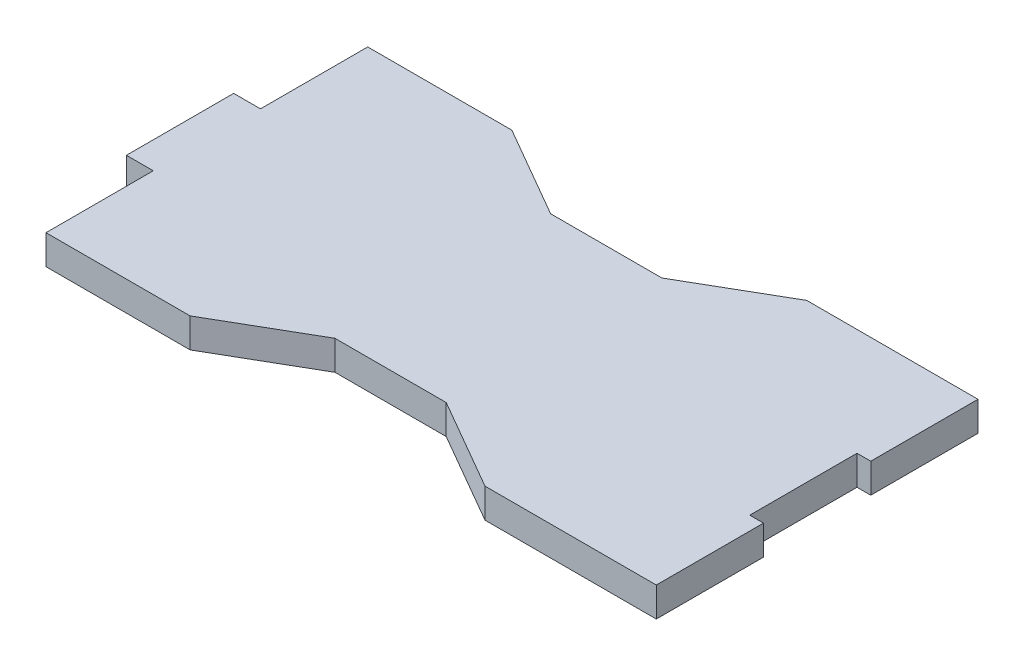
ISO-10303-21;
HEADER;
FILE_DESCRIPTION(('STEP AP214'),'2;1');
FILE_NAME('part.step','',(''),(''),'','','');
FILE_SCHEMA(('AUTOMOTIVE_DESIGN { 1 0 10303 214 1 1 1 1 }'));
ENDSEC;
DATA;
#1=APPLICATION_CONTEXT('core data for automotive mechanical design processes');
#2=APPLICATION_PROTOCOL_DEFINITION('international standard','automotive_design',2000,#1);
#3=PRODUCT_CONTEXT('',#1,'mechanical');
#4=PRODUCT('Part','Part','',(#3));
#5=PRODUCT_RELATED_PRODUCT_CATEGORY('part','',(#4));
#6=PRODUCT_DEFINITION_FORMATION('','',#4);
#7=PRODUCT_DEFINITION_CONTEXT('part definition',#1,'design');
#8=PRODUCT_DEFINITION('design','',#6,#7);
#9=PRODUCT_DEFINITION_SHAPE('','',#8);
#10=(LENGTH_UNIT() NAMED_UNIT(*) SI_UNIT(.MILLI.,.METRE.));
#11=(NAMED_UNIT(*) PLANE_ANGLE_UNIT() SI_UNIT($,.RADIAN.));
#12=(NAMED_UNIT(*) SI_UNIT($,.STERADIAN.) SOLID_ANGLE_UNIT());
#13=UNCERTAINTY_MEASURE_WITH_UNIT(LENGTH_MEASURE(1.E-05),#10,'distance_accuracy_value','');
#14=(GEOMETRIC_REPRESENTATION_CONTEXT(3) GLOBAL_UNCERTAINTY_ASSIGNED_CONTEXT((#13)) GLOBAL_UNIT_ASSIGNED_CONTEXT((#10,
#11,#12)) REPRESENTATION_CONTEXT('',''));
#15=CARTESIAN_POINT('',(0.,0.,0.));
#16=DIRECTION('',(0.,0.,1.));
#17=DIRECTION('',(1.,0.,0.));
#18=AXIS2_PLACEMENT_3D('',#15,#16,#17);
#19=CARTESIAN_POINT('',(-136.268191522893,2.2,-1.89110104690935E-12));
#20=DIRECTION('',(-1.,0.,0.));
#21=DIRECTION('',(0.,0.,1.));
#22=AXIS2_PLACEMENT_3D('',#19,#20,#21);
#23=PLANE('',#22);
#24=DIRECTION('',(0.,0.,-1.));
#25=VECTOR('',#24,1.);
#26=CARTESIAN_POINT('',(-136.268191522893,0.,-1.89110104690935E-12));
#27=LINE('',#26,#25);
#28=CARTESIAN_POINT('',(-136.268191522893,0.,-3.8659042385574));
#29=VERTEX_POINT('',#28);
#30=CARTESIAN_POINT('',(-136.268191522893,0.,-11.8659042385511));
#31=VERTEX_POINT('',#30);
#32=EDGE_CURVE('E201',#29,#31,#27,.T.);
#33=ORIENTED_EDGE('',*,*,#32,.F.);
#34=DIRECTION('',(0.,-1.,0.));
#35=VECTOR('',#34,1.);
#36=CARTESIAN_POINT('',(-136.268191522893,2.2,-3.8659042385574));
#37=LINE('',#36,#35);
#38=CARTESIAN_POINT('',(-136.268191522893,2.2,-3.8659042385574));
#39=VERTEX_POINT('',#38);
#40=EDGE_CURVE('E11',#39,#29,#37,.T.);
#41=ORIENTED_EDGE('',*,*,#40,.F.);
#42=DIRECTION('',(0.,0.,-1.));
#43=VECTOR('',#42,1.);
#44=CARTESIAN_POINT('',(-136.268191522893,2.2,-1.89110104690935E-12));
#45=LINE('',#44,#43);
#46=CARTESIAN_POINT('',(-136.268191522893,2.2,-11.8659042385511));
#47=VERTEX_POINT('',#46);
#48=EDGE_CURVE('E249',#39,#47,#45,.T.);
#49=ORIENTED_EDGE('',*,*,#48,.T.);
#50=DIRECTION('',(0.,-1.,0.));
#51=VECTOR('',#50,1.);
#52=CARTESIAN_POINT('',(-136.268191522893,2.2,-11.8659042385511));
#53=LINE('',#52,#51);
#54=EDGE_CURVE('E123',#47,#31,#53,.T.);
#55=ORIENTED_EDGE('',*,*,#54,.T.);
#56=EDGE_LOOP('',(#33,#41,#49,#55));
#57=FACE_BOUND('',#56,.T.);
#58=ADVANCED_FACE('F37',(#57),#23,.T.);
#59=CARTESIAN_POINT('',(0.,2.2,-3.8659042385574));
#60=DIRECTION('',(0.,0.,-1.));
#61=DIRECTION('',(-1.,0.,0.));
#62=AXIS2_PLACEMENT_3D('',#59,#60,#61);
#63=PLANE('',#62);
#64=DIRECTION('',(1.,0.,0.));
#65=VECTOR('',#64,1.);
#66=CARTESIAN_POINT('',(0.,0.,-3.8659042385574));
#67=LINE('',#66,#65);
#68=CARTESIAN_POINT('',(-138.268191522885,0.,-3.8659042385574));
#69=VERTEX_POINT('',#68);
#70=EDGE_CURVE('E204',#69,#29,#67,.T.);
#71=ORIENTED_EDGE('',*,*,#70,.F.);
#72=DIRECTION('',(0.,-1.,0.));
#73=VECTOR('',#72,1.);
#74=CARTESIAN_POINT('',(-138.268191522885,2.2,-3.8659042385574));
#75=LINE('',#74,#73);
#76=CARTESIAN_POINT('',(-138.268191522885,2.2,-3.8659042385574));
#77=VERTEX_POINT('',#76);
#78=EDGE_CURVE('E45',#77,#69,#75,.T.);
#79=ORIENTED_EDGE('',*,*,#78,.F.);
#80=DIRECTION('',(1.,0.,0.));
#81=VECTOR('',#80,1.);
#82=CARTESIAN_POINT('',(0.,2.2,-3.8659042385574));
#83=LINE('',#82,#81);
#84=EDGE_CURVE('E309',#77,#39,#83,.T.);
#85=ORIENTED_EDGE('',*,*,#84,.T.);
#86=ORIENTED_EDGE('',*,*,#40,.T.);
#87=EDGE_LOOP('',(#71,#79,#85,#86));
#88=FACE_BOUND('',#87,.T.);
#89=ADVANCED_FACE('F297',(#88),#63,.T.);
#90=CARTESIAN_POINT('',(-138.268191522885,2.2,0.));
#91=DIRECTION('',(-1.,0.,0.));
#92=DIRECTION('',(0.,0.,1.));
#93=AXIS2_PLACEMENT_3D('',#90,#91,#92);
#94=PLANE('',#93);
#95=DIRECTION('',(0.,0.,-1.));
#96=VECTOR('',#95,1.);
#97=CARTESIAN_POINT('',(-138.268191522885,0.,0.));
#98=LINE('',#97,#96);
#99=CARTESIAN_POINT('',(-138.268191522885,0.,4.13409576144266));
#100=VERTEX_POINT('',#99);
#101=EDGE_CURVE('E207',#100,#69,#98,.T.);
#102=ORIENTED_EDGE('',*,*,#101,.F.);
#103=DIRECTION('',(0.,-1.,0.));
#104=VECTOR('',#103,1.);
#105=CARTESIAN_POINT('',(-138.268191522885,2.2,4.13409576144266));
#106=LINE('',#105,#104);
#107=CARTESIAN_POINT('',(-138.268191522885,2.2,4.13409576144266));
#108=VERTEX_POINT('',#107);
#109=EDGE_CURVE('E286',#108,#100,#106,.T.);
#110=ORIENTED_EDGE('',*,*,#109,.F.);
#111=DIRECTION('',(0.,0.,-1.));
#112=VECTOR('',#111,1.);
#113=CARTESIAN_POINT('',(-138.268191522885,2.2,0.));
#114=LINE('',#113,#112);
#115=EDGE_CURVE('E293',#108,#77,#114,.T.);
#116=ORIENTED_EDGE('',*,*,#115,.T.);
#117=ORIENTED_EDGE('',*,*,#78,.T.);
#118=EDGE_LOOP('',(#102,#110,#116,#117));
#119=FACE_BOUND('',#118,.T.);
#120=ADVANCED_FACE('F291',(#119),#94,.T.);
#121=CARTESIAN_POINT('',(-1.14744207509082E-13,2.2,4.1340957614465));
#122=DIRECTION('',(0.,0.,1.));
#123=DIRECTION('',(1.,0.,0.));
#124=AXIS2_PLACEMENT_3D('',#121,#122,#123);
#125=PLANE('',#124);
#126=DIRECTION('',(-1.,0.,0.));
#127=VECTOR('',#126,1.);
#128=CARTESIAN_POINT('',(-1.14744207509082E-13,0.,4.1340957614465));
#129=LINE('',#128,#127);
#130=CARTESIAN_POINT('',(-136.268191522893,0.,4.13409576144272));
#131=VERTEX_POINT('',#130);
#132=EDGE_CURVE('E210',#131,#100,#129,.T.);
#133=ORIENTED_EDGE('',*,*,#132,.F.);
#134=DIRECTION('',(0.,-1.,0.));
#135=VECTOR('',#134,1.);
#136=CARTESIAN_POINT('',(-136.268191522893,2.2,4.13409576144272));
#137=LINE('',#136,#135);
#138=CARTESIAN_POINT('',(-136.268191522893,2.2,4.13409576144272));
#139=VERTEX_POINT('',#138);
#140=EDGE_CURVE('E284',#139,#131,#137,.T.);
#141=ORIENTED_EDGE('',*,*,#140,.F.);
#142=DIRECTION('',(-1.,0.,0.));
#143=VECTOR('',#142,1.);
#144=CARTESIAN_POINT('',(-1.14744207509082E-13,2.2,4.1340957614465));
#145=LINE('',#144,#143);
#146=EDGE_CURVE('E306',#139,#108,#145,.T.);
#147=ORIENTED_EDGE('',*,*,#146,.T.);
#148=ORIENTED_EDGE('',*,*,#109,.T.);
#149=EDGE_LOOP('',(#133,#141,#147,#148));
#150=FACE_BOUND('',#149,.T.);
#151=ADVANCED_FACE('F303',(#150),#125,.T.);
#152=CARTESIAN_POINT('',(-136.268191522893,2.2,-1.89110104690933E-12));
#153=DIRECTION('',(-1.,0.,0.));
#154=DIRECTION('',(0.,0.,1.));
#155=AXIS2_PLACEMENT_3D('',#152,#153,#154);
#156=PLANE('',#155);
#157=DIRECTION('',(0.,0.,-1.));
#158=VECTOR('',#157,1.);
#159=CARTESIAN_POINT('',(-136.268191522893,0.,-1.89110104690933E-12));
#160=LINE('',#159,#158);
#161=CARTESIAN_POINT('',(-136.268191522893,0.,12.1340957614512));
#162=VERTEX_POINT('',#161);
#163=EDGE_CURVE('E213',#162,#131,#160,.T.);
#164=ORIENTED_EDGE('',*,*,#163,.F.);
#165=DIRECTION('',(0.,-1.,0.));
#166=VECTOR('',#165,1.);
#167=CARTESIAN_POINT('',(-136.268191522893,2.2,12.1340957614512));
#168=LINE('',#167,#166);
#169=CARTESIAN_POINT('',(-136.268191522893,2.2,12.1340957614512));
#170=VERTEX_POINT('',#169);
#171=EDGE_CURVE('E282',#170,#162,#168,.T.);
#172=ORIENTED_EDGE('',*,*,#171,.F.);
#173=DIRECTION('',(0.,0.,-1.));
#174=VECTOR('',#173,1.);
#175=CARTESIAN_POINT('',(-136.268191522893,2.2,-1.89110104690933E-12));
#176=LINE('',#175,#174);
#177=EDGE_CURVE('E311',#170,#139,#176,.T.);
#178=ORIENTED_EDGE('',*,*,#177,.T.);
#179=ORIENTED_EDGE('',*,*,#140,.T.);
#180=EDGE_LOOP('',(#164,#172,#178,#179));
#181=FACE_BOUND('',#180,.T.);
#182=ADVANCED_FACE('F367',(#181),#156,.T.);
#183=CARTESIAN_POINT('',(0.,2.2,12.1340957614512));
#184=DIRECTION('',(0.,0.,1.));
#185=DIRECTION('',(1.,0.,0.));
#186=AXIS2_PLACEMENT_3D('',#183,#184,#185);
#187=PLANE('',#186);
#188=DIRECTION('',(-1.,0.,0.));
#189=VECTOR('',#188,1.);
#190=CARTESIAN_POINT('',(0.,0.,12.1340957614512));
#191=LINE('',#190,#189);
#192=CARTESIAN_POINT('',(-125.518191522863,0.,12.1340957614512));
#193=VERTEX_POINT('',#192);
#194=EDGE_CURVE('E216',#193,#162,#191,.T.);
#195=ORIENTED_EDGE('',*,*,#194,.F.);
#196=DIRECTION('',(0.,-1.,0.));
#197=VECTOR('',#196,1.);
#198=CARTESIAN_POINT('',(-125.518191522863,2.2,12.1340957614512));
#199=LINE('',#198,#197);
#200=CARTESIAN_POINT('',(-125.518191522863,2.2,12.1340957614512));
#201=VERTEX_POINT('',#200);
#202=EDGE_CURVE('E280',#201,#193,#199,.T.);
#203=ORIENTED_EDGE('',*,*,#202,.F.);
#204=DIRECTION('',(-1.,0.,0.));
#205=VECTOR('',#204,1.);
#206=CARTESIAN_POINT('',(0.,2.2,12.1340957614512));
#207=LINE('',#206,#205);
#208=EDGE_CURVE('E317',#201,#170,#207,.T.);
#209=ORIENTED_EDGE('',*,*,#208,.T.);
#210=ORIENTED_EDGE('',*,*,#171,.T.);
#211=EDGE_LOOP('',(#195,#203,#209,#210));
#212=FACE_BOUND('',#211,.T.);
#213=ADVANCED_FACE('F370',(#212),#187,.T.);
#214=CARTESIAN_POINT('',(-26.1253302900311,2.2,-45.2503994268518));
#215=DIRECTION('',(-0.500000000000001,0.,-0.866025403784438));
#216=DIRECTION('',(-0.866025403784438,0.,0.500000000000001));
#217=AXIS2_PLACEMENT_3D('',#214,#215,#216);
#218=PLANE('',#217);
#219=DIRECTION('',(0.866025403784438,0.,-0.500000000000001));
#220=VECTOR('',#219,1.);
#221=CARTESIAN_POINT('',(-26.1253302900311,0.,-45.2503994268518));
#222=LINE('',#221,#220);
#223=CARTESIAN_POINT('',(-118.668049618969,0.,8.17916448925064));
#224=VERTEX_POINT('',#223);
#225=EDGE_CURVE('E219',#193,#224,#222,.T.);
#226=ORIENTED_EDGE('',*,*,#225,.T.);
#227=DIRECTION('',(0.,-1.,0.));
#228=VECTOR('',#227,1.);
#229=CARTESIAN_POINT('',(-118.668049618969,2.2,8.17916448925064));
#230=LINE('',#229,#228);
#231=CARTESIAN_POINT('',(-118.668049618969,2.2,8.17916448925064));
#232=VERTEX_POINT('',#231);
#233=EDGE_CURVE('E277',#232,#224,#230,.T.);
#234=ORIENTED_EDGE('',*,*,#233,.F.);
#235=DIRECTION('',(0.866025403784438,0.,-0.500000000000001));
#236=VECTOR('',#235,1.);
#237=CARTESIAN_POINT('',(-26.1253302900311,2.2,-45.2503994268518));
#238=LINE('',#237,#236);
#239=EDGE_CURVE('E320',#201,#232,#238,.T.);
#240=ORIENTED_EDGE('',*,*,#239,.F.);
#241=ORIENTED_EDGE('',*,*,#202,.T.);
#242=EDGE_LOOP('',(#226,#234,#240,#241));
#243=FACE_BOUND('',#242,.T.);
#244=ADVANCED_FACE('F374',(#243),#218,.F.);
#245=CARTESIAN_POINT('',(0.,2.2,8.17916448925064));
#246=DIRECTION('',(0.,0.,-1.));
#247=DIRECTION('',(-1.,0.,0.));
#248=AXIS2_PLACEMENT_3D('',#245,#246,#247);
#249=PLANE('',#248);
#250=DIRECTION('',(1.,0.,0.));
#251=VECTOR('',#250,1.);
#252=CARTESIAN_POINT('',(0.,0.,8.17916448925064));
#253=LINE('',#252,#251);
#254=CARTESIAN_POINT('',(-110.368333426758,0.,8.17916448925064));
#255=VERTEX_POINT('',#254);
#256=EDGE_CURVE('E221',#224,#255,#253,.T.);
#257=ORIENTED_EDGE('',*,*,#256,.T.);
#258=DIRECTION('',(0.,-1.,0.));
#259=VECTOR('',#258,1.);
#260=CARTESIAN_POINT('',(-110.368333426758,2.2,8.17916448925064));
#261=LINE('',#260,#259);
#262=CARTESIAN_POINT('',(-110.368333426758,2.2,8.17916448925064));
#263=VERTEX_POINT('',#262);
#264=EDGE_CURVE('E275',#263,#255,#261,.T.);
#265=ORIENTED_EDGE('',*,*,#264,.F.);
#266=DIRECTION('',(1.,0.,0.));
#267=VECTOR('',#266,1.);
#268=CARTESIAN_POINT('',(0.,2.2,8.17916448925064));
#269=LINE('',#268,#267);
#270=EDGE_CURVE('E322',#232,#263,#269,.T.);
#271=ORIENTED_EDGE('',*,*,#270,.F.);
#272=ORIENTED_EDGE('',*,*,#233,.T.);
#273=EDGE_LOOP('',(#257,#265,#271,#272));
#274=FACE_BOUND('',#273,.T.);
#275=ADVANCED_FACE('F378',(#274),#249,.F.);
#276=CARTESIAN_POINT('',(-31.1337654714009,2.2,53.9252636273999));
#277=DIRECTION('',(-0.5,0.,0.866025403784439));
#278=DIRECTION('',(0.866025403784439,0.,0.5));
#279=AXIS2_PLACEMENT_3D('',#276,#277,#278);
#280=PLANE('',#279);
#281=DIRECTION('',(-0.866025403784439,0.,-0.5));
#282=VECTOR('',#281,1.);
#283=CARTESIAN_POINT('',(-31.1337654714009,0.,53.9252636273999));
#284=LINE('',#283,#282);
#285=CARTESIAN_POINT('',(-103.518191522864,0.,12.134095761451));
#286=VERTEX_POINT('',#285);
#287=EDGE_CURVE('E224',#286,#255,#284,.T.);
#288=ORIENTED_EDGE('',*,*,#287,.F.);
#289=DIRECTION('',(0.,-1.,0.));
#290=VECTOR('',#289,1.);
#291=CARTESIAN_POINT('',(-103.518191522864,2.2,12.134095761451));
#292=LINE('',#291,#290);
#293=CARTESIAN_POINT('',(-103.518191522864,2.2,12.134095761451));
#294=VERTEX_POINT('',#293);
#295=EDGE_CURVE('E273',#294,#286,#292,.T.);
#296=ORIENTED_EDGE('',*,*,#295,.F.);
#297=DIRECTION('',(-0.866025403784439,0.,-0.5));
#298=VECTOR('',#297,1.);
#299=CARTESIAN_POINT('',(-31.1337654714009,2.2,53.9252636273999));
#300=LINE('',#299,#298);
#301=EDGE_CURVE('E324',#294,#263,#300,.T.);
#302=ORIENTED_EDGE('',*,*,#301,.T.);
#303=ORIENTED_EDGE('',*,*,#264,.T.);
#304=EDGE_LOOP('',(#288,#296,#302,#303));
#305=FACE_BOUND('',#304,.T.);
#306=ADVANCED_FACE('F382',(#305),#280,.T.);
#307=CARTESIAN_POINT('',(0.,2.2,12.134095761451));
#308=DIRECTION('',(0.,0.,1.));
#309=DIRECTION('',(1.,0.,0.));
#310=AXIS2_PLACEMENT_3D('',#307,#308,#309);
#311=PLANE('',#310);
#312=DIRECTION('',(-1.,0.,0.));
#313=VECTOR('',#312,1.);
#314=CARTESIAN_POINT('',(0.,0.,12.134095761451));
#315=LINE('',#314,#313);
#316=CARTESIAN_POINT('',(-90.7419726454355,0.,12.134095761451));
#317=VERTEX_POINT('',#316);
#318=EDGE_CURVE('E227',#317,#286,#315,.T.);
#319=ORIENTED_EDGE('',*,*,#318,.F.);
#320=DIRECTION('',(0.,-1.,0.));
#321=VECTOR('',#320,1.);
#322=CARTESIAN_POINT('',(-90.7419726454355,2.2,12.134095761451));
#323=LINE('',#322,#321);
#324=CARTESIAN_POINT('',(-90.7419726454355,2.2,12.134095761451));
#325=VERTEX_POINT('',#324);
#326=EDGE_CURVE('E271',#325,#317,#323,.T.);
#327=ORIENTED_EDGE('',*,*,#326,.F.);
#328=DIRECTION('',(-1.,0.,0.));
#329=VECTOR('',#328,1.);
#330=CARTESIAN_POINT('',(0.,2.2,12.134095761451));
#331=LINE('',#330,#329);
#332=EDGE_CURVE('E327',#325,#294,#331,.T.);
#333=ORIENTED_EDGE('',*,*,#332,.T.);
#334=ORIENTED_EDGE('',*,*,#295,.T.);
#335=EDGE_LOOP('',(#319,#327,#333,#334));
#336=FACE_BOUND('',#335,.T.);
#337=ADVANCED_FACE('F386',(#336),#311,.T.);
#338=CARTESIAN_POINT('',(-90.7419726454355,2.2,-8.39531894423924E-13));
#339=DIRECTION('',(-1.,0.,0.));
#340=DIRECTION('',(0.,0.,1.));
#341=AXIS2_PLACEMENT_3D('',#338,#339,#340);
#342=PLANE('',#341);
#343=DIRECTION('',(0.,0.,-1.));
#344=VECTOR('',#343,1.);
#345=CARTESIAN_POINT('',(-90.7419726454355,0.,-8.39531894423924E-13));
#346=LINE('',#345,#344);
#347=CARTESIAN_POINT('',(-90.7419726454355,0.,4.13409576144355));
#348=VERTEX_POINT('',#347);
#349=EDGE_CURVE('E230',#317,#348,#346,.T.);
#350=ORIENTED_EDGE('',*,*,#349,.T.);
#351=DIRECTION('',(0.,-1.,0.));
#352=VECTOR('',#351,1.);
#353=CARTESIAN_POINT('',(-90.7419726454355,2.2,4.13409576144355));
#354=LINE('',#353,#352);
#355=CARTESIAN_POINT('',(-90.7419726454355,2.2,4.13409576144355));
#356=VERTEX_POINT('',#355);
#357=EDGE_CURVE('E268',#356,#348,#354,.T.);
#358=ORIENTED_EDGE('',*,*,#357,.F.);
#359=DIRECTION('',(0.,0.,-1.));
#360=VECTOR('',#359,1.);
#361=CARTESIAN_POINT('',(-90.7419726454355,2.2,-8.39531894423924E-13));
#362=LINE('',#361,#360);
#363=EDGE_CURVE('E330',#325,#356,#362,.T.);
#364=ORIENTED_EDGE('',*,*,#363,.F.);
#365=ORIENTED_EDGE('',*,*,#326,.T.);
#366=EDGE_LOOP('',(#350,#358,#364,#365));
#367=FACE_BOUND('',#366,.T.);
#368=ADVANCED_FACE('F390',(#367),#342,.F.);
#369=CARTESIAN_POINT('',(0.,2.2,4.13409576144355));
#370=DIRECTION('',(0.,0.,1.));
#371=DIRECTION('',(1.,0.,0.));
#372=AXIS2_PLACEMENT_3D('',#369,#370,#371);
#373=PLANE('',#372);
#374=DIRECTION('',(-1.,0.,0.));
#375=VECTOR('',#374,1.);
#376=CARTESIAN_POINT('',(0.,0.,4.13409576144355));
#377=LINE('',#376,#375);
#378=CARTESIAN_POINT('',(-91.7681915228503,0.,4.13409576144355));
#379=VERTEX_POINT('',#378);
#380=EDGE_CURVE('E232',#348,#379,#377,.T.);
#381=ORIENTED_EDGE('',*,*,#380,.T.);
#382=DIRECTION('',(0.,-1.,0.));
#383=VECTOR('',#382,1.);
#384=CARTESIAN_POINT('',(-91.7681915228503,2.2,4.13409576144355));
#385=LINE('',#384,#383);
#386=CARTESIAN_POINT('',(-91.7681915228503,2.2,4.13409576144355));
#387=VERTEX_POINT('',#386);
#388=EDGE_CURVE('E265',#387,#379,#385,.T.);
#389=ORIENTED_EDGE('',*,*,#388,.F.);
#390=DIRECTION('',(-1.,0.,0.));
#391=VECTOR('',#390,1.);
#392=CARTESIAN_POINT('',(0.,2.2,4.13409576144355));
#393=LINE('',#392,#391);
#394=EDGE_CURVE('E332',#356,#387,#393,.T.);
#395=ORIENTED_EDGE('',*,*,#394,.F.);
#396=ORIENTED_EDGE('',*,*,#357,.T.);
#397=EDGE_LOOP('',(#381,#389,#395,#396));
#398=FACE_BOUND('',#397,.T.);
#399=ADVANCED_FACE('F392',(#398),#373,.F.);
#400=CARTESIAN_POINT('',(-91.7681915228502,2.2,-1.27353948946098E-12));
#401=DIRECTION('',(-1.,0.,0.));
#402=DIRECTION('',(0.,0.,1.));
#403=AXIS2_PLACEMENT_3D('',#400,#401,#402);
#404=PLANE('',#403);
#405=DIRECTION('',(0.,0.,-1.));
#406=VECTOR('',#405,1.);
#407=CARTESIAN_POINT('',(-91.7681915228502,0.,-1.27353948946098E-12));
#408=LINE('',#407,#406);
#409=CARTESIAN_POINT('',(-91.7681915228502,0.,-3.86590423855651));
#410=VERTEX_POINT('',#409);
#411=EDGE_CURVE('E235',#379,#410,#408,.T.);
#412=ORIENTED_EDGE('',*,*,#411,.T.);
#413=DIRECTION('',(0.,-1.,0.));
#414=VECTOR('',#413,1.);
#415=CARTESIAN_POINT('',(-91.7681915228502,2.2,-3.86590423855651));
#416=LINE('',#415,#414);
#417=CARTESIAN_POINT('',(-91.7681915228502,2.2,-3.86590423855651));
#418=VERTEX_POINT('',#417);
#419=EDGE_CURVE('E262',#418,#410,#416,.T.);
#420=ORIENTED_EDGE('',*,*,#419,.F.);
#421=DIRECTION('',(0.,0.,-1.));
#422=VECTOR('',#421,1.);
#423=CARTESIAN_POINT('',(-91.7681915228502,2.2,-1.27353948946098E-12));
#424=LINE('',#423,#422);
#425=EDGE_CURVE('E335',#387,#418,#424,.T.);
#426=ORIENTED_EDGE('',*,*,#425,.F.);
#427=ORIENTED_EDGE('',*,*,#388,.T.);
#428=EDGE_LOOP('',(#412,#420,#426,#427));
#429=FACE_BOUND('',#428,.T.);
#430=ADVANCED_FACE('F395',(#429),#404,.F.);
#431=CARTESIAN_POINT('',(0.,2.2,-3.86590423855651));
#432=DIRECTION('',(0.,0.,-1.));
#433=DIRECTION('',(-1.,0.,0.));
#434=AXIS2_PLACEMENT_3D('',#431,#432,#433);
#435=PLANE('',#434);
#436=DIRECTION('',(1.,0.,0.));
#437=VECTOR('',#436,1.);
#438=CARTESIAN_POINT('',(0.,0.,-3.86590423855651));
#439=LINE('',#438,#437);
#440=CARTESIAN_POINT('',(-90.7419726454354,0.,-3.86590423855651));
#441=VERTEX_POINT('',#440);
#442=EDGE_CURVE('E237',#410,#441,#439,.T.);
#443=ORIENTED_EDGE('',*,*,#442,.T.);
#444=DIRECTION('',(0.,-1.,0.));
#445=VECTOR('',#444,1.);
#446=CARTESIAN_POINT('',(-90.7419726454354,2.2,-3.86590423855651));
#447=LINE('',#446,#445);
#448=CARTESIAN_POINT('',(-90.7419726454354,2.2,-3.86590423855651));
#449=VERTEX_POINT('',#448);
#450=EDGE_CURVE('E259',#449,#441,#447,.T.);
#451=ORIENTED_EDGE('',*,*,#450,.F.);
#452=DIRECTION('',(1.,0.,0.));
#453=VECTOR('',#452,1.);
#454=CARTESIAN_POINT('',(0.,2.2,-3.86590423855651));
#455=LINE('',#454,#453);
#456=EDGE_CURVE('E337',#418,#449,#455,.T.);
#457=ORIENTED_EDGE('',*,*,#456,.F.);
#458=ORIENTED_EDGE('',*,*,#419,.T.);
#459=EDGE_LOOP('',(#443,#451,#457,#458));
#460=FACE_BOUND('',#459,.T.);
#461=ADVANCED_FACE('F399',(#460),#435,.F.);
#462=CARTESIAN_POINT('',(-90.7419726454355,0.,-11.8659042385522));
#463=VERTEX_POINT('',#462);
#464=EDGE_CURVE('E233',#441,#463,#346,.T.);
#465=ORIENTED_EDGE('',*,*,#464,.T.);
#466=DIRECTION('',(0.,-1.,0.));
#467=VECTOR('',#466,1.);
#468=CARTESIAN_POINT('',(-90.7419726454355,2.2,-11.8659042385522));
#469=LINE('',#468,#467);
#470=CARTESIAN_POINT('',(-90.7419726454355,2.2,-11.8659042385522));
#471=VERTEX_POINT('',#470);
#472=EDGE_CURVE('E256',#471,#463,#469,.T.);
#473=ORIENTED_EDGE('',*,*,#472,.F.);
#474=EDGE_CURVE('E333',#449,#471,#362,.T.);
#475=ORIENTED_EDGE('',*,*,#474,.F.);
#476=ORIENTED_EDGE('',*,*,#450,.T.);
#477=EDGE_LOOP('',(#465,#473,#475,#476));
#478=FACE_BOUND('',#477,.T.);
#479=ADVANCED_FACE('F347',(#478),#342,.F.);
#480=CARTESIAN_POINT('',(0.,2.2,-11.8659042385522));
#481=DIRECTION('',(0.,0.,1.));
#482=DIRECTION('',(1.,0.,0.));
#483=AXIS2_PLACEMENT_3D('',#480,#481,#482);
#484=PLANE('',#483);
#485=DIRECTION('',(-1.,0.,0.));
#486=VECTOR('',#485,1.);
#487=CARTESIAN_POINT('',(0.,0.,-11.8659042385522));
#488=LINE('',#487,#486);
#489=CARTESIAN_POINT('',(-103.518191522863,0.,-11.8659042385522));
#490=VERTEX_POINT('',#489);
#491=EDGE_CURVE('E239',#463,#490,#488,.T.);
#492=ORIENTED_EDGE('',*,*,#491,.T.);
#493=DIRECTION('',(0.,-1.,0.));
#494=VECTOR('',#493,1.);
#495=CARTESIAN_POINT('',(-103.518191522863,2.2,-11.8659042385522));
#496=LINE('',#495,#494);
#497=CARTESIAN_POINT('',(-103.518191522863,2.2,-11.8659042385522));
#498=VERTEX_POINT('',#497);
#499=EDGE_CURVE('E253',#498,#490,#496,.T.);
#500=ORIENTED_EDGE('',*,*,#499,.F.);
#501=DIRECTION('',(-1.,0.,0.));
#502=VECTOR('',#501,1.);
#503=CARTESIAN_POINT('',(0.,2.2,-11.8659042385522));
#504=LINE('',#503,#502);
#505=EDGE_CURVE('E339',#471,#498,#504,.T.);
#506=ORIENTED_EDGE('',*,*,#505,.F.);
#507=ORIENTED_EDGE('',*,*,#472,.T.);
#508=EDGE_LOOP('',(#492,#500,#506,#507));
#509=FACE_BOUND('',#508,.T.);
#510=ADVANCED_FACE('F351',(#509),#484,.F.);
#511=CARTESIAN_POINT('',(-31.0176351354458,2.2,-53.7241199852256));
#512=DIRECTION('',(0.500000000000001,0.,0.866025403784438));
#513=DIRECTION('',(0.866025403784438,0.,-0.500000000000001));
#514=AXIS2_PLACEMENT_3D('',#511,#512,#513);
#515=PLANE('',#514);
#516=DIRECTION('',(-0.866025403784438,0.,0.500000000000001));
#517=VECTOR('',#516,1.);
#518=CARTESIAN_POINT('',(-31.0176351354458,0.,-53.7241199852256));
#519=LINE('',#518,#517);
#520=CARTESIAN_POINT('',(-110.368333426759,0.,-7.91097296635108));
#521=VERTEX_POINT('',#520);
#522=EDGE_CURVE('E241',#490,#521,#519,.T.);
#523=ORIENTED_EDGE('',*,*,#522,.T.);
#524=DIRECTION('',(0.,-1.,0.));
#525=VECTOR('',#524,1.);
#526=CARTESIAN_POINT('',(-110.368333426759,2.2,-7.91097296635108));
#527=LINE('',#526,#525);
#528=CARTESIAN_POINT('',(-110.368333426759,2.2,-7.91097296635108));
#529=VERTEX_POINT('',#528);
#530=EDGE_CURVE('E188',#529,#521,#527,.T.);
#531=ORIENTED_EDGE('',*,*,#530,.F.);
#532=DIRECTION('',(-0.866025403784438,0.,0.500000000000001));
#533=VECTOR('',#532,1.);
#534=CARTESIAN_POINT('',(-31.0176351354458,2.2,-53.7241199852256));
#535=LINE('',#534,#533);
#536=EDGE_CURVE('E193',#498,#529,#535,.T.);
#537=ORIENTED_EDGE('',*,*,#536,.F.);
#538=ORIENTED_EDGE('',*,*,#499,.T.);
#539=EDGE_LOOP('',(#523,#531,#537,#538));
#540=FACE_BOUND('',#539,.T.);
#541=ADVANCED_FACE('F354',(#540),#515,.F.);
#542=CARTESIAN_POINT('',(0.,2.2,-7.91097296635108));
#543=DIRECTION('',(0.,0.,-1.));
#544=DIRECTION('',(-1.,0.,0.));
#545=AXIS2_PLACEMENT_3D('',#542,#543,#544);
#546=PLANE('',#545);
#547=DIRECTION('',(1.,0.,0.));
#548=VECTOR('',#547,1.);
#549=CARTESIAN_POINT('',(0.,0.,-7.91097296635108));
#550=LINE('',#549,#548);
#551=CARTESIAN_POINT('',(-118.668049618969,0.,-7.91097296635108));
#552=VERTEX_POINT('',#551);
#553=EDGE_CURVE('E183',#552,#521,#550,.T.);
#554=ORIENTED_EDGE('',*,*,#553,.F.);
#555=DIRECTION('',(0.,-1.,0.));
#556=VECTOR('',#555,1.);
#557=CARTESIAN_POINT('',(-118.668049618969,2.2,-7.91097296635108));
#558=LINE('',#557,#556);
#559=CARTESIAN_POINT('',(-118.668049618969,2.2,-7.91097296635108));
#560=VERTEX_POINT('',#559);
#561=EDGE_CURVE('E178',#560,#552,#558,.T.);
#562=ORIENTED_EDGE('',*,*,#561,.F.);
#563=DIRECTION('',(1.,0.,0.));
#564=VECTOR('',#563,1.);
#565=CARTESIAN_POINT('',(0.,2.2,-7.91097296635108));
#566=LINE('',#565,#564);
#567=EDGE_CURVE('E181',#560,#529,#566,.T.);
#568=ORIENTED_EDGE('',*,*,#567,.T.);
#569=ORIENTED_EDGE('',*,*,#530,.T.);
#570=EDGE_LOOP('',(#554,#562,#568,#569));
#571=FACE_BOUND('',#570,.T.);
#572=ADVANCED_FACE('F180',(#571),#546,.T.);
#573=CARTESIAN_POINT('',(-26.2414606259862,2.2,45.4515430690263));
#574=DIRECTION('',(0.5,0.,-0.866025403784439));
#575=DIRECTION('',(-0.866025403784439,0.,-0.5));
#576=AXIS2_PLACEMENT_3D('',#573,#574,#575);
#577=PLANE('',#576);
#578=DIRECTION('',(0.866025403784439,0.,0.5));
#579=VECTOR('',#578,1.);
#580=CARTESIAN_POINT('',(-26.2414606259862,0.,45.4515430690263));
#581=LINE('',#580,#579);
#582=CARTESIAN_POINT('',(-125.518191522862,0.,-11.8659042385511));
#583=VERTEX_POINT('',#582);
#584=EDGE_CURVE('E245',#583,#552,#581,.T.);
#585=ORIENTED_EDGE('',*,*,#584,.F.);
#586=DIRECTION('',(0.,-1.,0.));
#587=VECTOR('',#586,1.);
#588=CARTESIAN_POINT('',(-125.518191522862,2.2,-11.8659042385511));
#589=LINE('',#588,#587);
#590=CARTESIAN_POINT('',(-125.518191522862,2.2,-11.8659042385511));
#591=VERTEX_POINT('',#590);
#592=EDGE_CURVE('E116',#591,#583,#589,.T.);
#593=ORIENTED_EDGE('',*,*,#592,.F.);
#594=DIRECTION('',(0.866025403784439,0.,0.5));
#595=VECTOR('',#594,1.);
#596=CARTESIAN_POINT('',(-26.2414606259862,2.2,45.4515430690263));
#597=LINE('',#596,#595);
#598=EDGE_CURVE('E191',#591,#560,#597,.T.);
#599=ORIENTED_EDGE('',*,*,#598,.T.);
#600=ORIENTED_EDGE('',*,*,#561,.T.);
#601=EDGE_LOOP('',(#585,#593,#599,#600));
#602=FACE_BOUND('',#601,.T.);
#603=ADVANCED_FACE('F196',(#602),#577,.T.);
#604=CARTESIAN_POINT('',(0.,2.2,-11.8659042385511));
#605=DIRECTION('',(0.,0.,1.));
#606=DIRECTION('',(1.,0.,0.));
#607=AXIS2_PLACEMENT_3D('',#604,#605,#606);
#608=PLANE('',#607);
#609=DIRECTION('',(-1.,0.,0.));
#610=VECTOR('',#609,1.);
#611=CARTESIAN_POINT('',(0.,0.,-11.8659042385511));
#612=LINE('',#611,#610);
#613=EDGE_CURVE('E247',#583,#31,#612,.T.);
#614=ORIENTED_EDGE('',*,*,#613,.T.);
#615=ORIENTED_EDGE('',*,*,#54,.F.);
#616=DIRECTION('',(-1.,0.,0.));
#617=VECTOR('',#616,1.);
#618=CARTESIAN_POINT('',(0.,2.2,-11.8659042385511));
#619=LINE('',#618,#617);
#620=EDGE_CURVE('E53',#591,#47,#619,.T.);
#621=ORIENTED_EDGE('',*,*,#620,.F.);
#622=ORIENTED_EDGE('',*,*,#592,.T.);
#623=EDGE_LOOP('',(#614,#615,#621,#622));
#624=FACE_BOUND('',#623,.T.);
#625=ADVANCED_FACE('F355',(#624),#608,.F.);
#626=CARTESIAN_POINT('',(0.,2.2,0.));
#627=DIRECTION('',(0.,1.,0.));
#628=DIRECTION('',(0.,0.,1.));
#629=AXIS2_PLACEMENT_3D('',#626,#627,#628);
#630=PLANE('',#629);
#631=ORIENTED_EDGE('',*,*,#48,.F.);
#632=ORIENTED_EDGE('',*,*,#84,.F.);
#633=ORIENTED_EDGE('',*,*,#115,.F.);
#634=ORIENTED_EDGE('',*,*,#146,.F.);
#635=ORIENTED_EDGE('',*,*,#177,.F.);
#636=ORIENTED_EDGE('',*,*,#208,.F.);
#637=ORIENTED_EDGE('',*,*,#239,.T.);
#638=ORIENTED_EDGE('',*,*,#270,.T.);
#639=ORIENTED_EDGE('',*,*,#301,.F.);
#640=ORIENTED_EDGE('',*,*,#332,.F.);
#641=ORIENTED_EDGE('',*,*,#363,.T.);
#642=ORIENTED_EDGE('',*,*,#394,.T.);
#643=ORIENTED_EDGE('',*,*,#425,.T.);
#644=ORIENTED_EDGE('',*,*,#456,.T.);
#645=ORIENTED_EDGE('',*,*,#474,.T.);
#646=ORIENTED_EDGE('',*,*,#505,.T.);
#647=ORIENTED_EDGE('',*,*,#536,.T.);
#648=ORIENTED_EDGE('',*,*,#567,.F.);
#649=ORIENTED_EDGE('',*,*,#598,.F.);
#650=ORIENTED_EDGE('',*,*,#620,.T.);
#651=EDGE_LOOP('',(#631,#632,#633,#634,#635,#636,#637,#638,#639,#640,#641,#642,#643,#644,#645,
#646,#647,#648,#649,#650));
#652=FACE_BOUND('',#651,.T.);
#653=ADVANCED_FACE('F190',(#652),#630,.T.);
#654=CARTESIAN_POINT('',(0.,0.,0.));
#655=DIRECTION('',(0.,1.,0.));
#656=DIRECTION('',(0.,0.,1.));
#657=AXIS2_PLACEMENT_3D('',#654,#655,#656);
#658=PLANE('',#657);
#659=ORIENTED_EDGE('',*,*,#32,.T.);
#660=ORIENTED_EDGE('',*,*,#613,.F.);
#661=ORIENTED_EDGE('',*,*,#584,.T.);
#662=ORIENTED_EDGE('',*,*,#553,.T.);
#663=ORIENTED_EDGE('',*,*,#522,.F.);
#664=ORIENTED_EDGE('',*,*,#491,.F.);
#665=ORIENTED_EDGE('',*,*,#464,.F.);
#666=ORIENTED_EDGE('',*,*,#442,.F.);
#667=ORIENTED_EDGE('',*,*,#411,.F.);
#668=ORIENTED_EDGE('',*,*,#380,.F.);
#669=ORIENTED_EDGE('',*,*,#349,.F.);
#670=ORIENTED_EDGE('',*,*,#318,.T.);
#671=ORIENTED_EDGE('',*,*,#287,.T.);
#672=ORIENTED_EDGE('',*,*,#256,.F.);
#673=ORIENTED_EDGE('',*,*,#225,.F.);
#674=ORIENTED_EDGE('',*,*,#194,.T.);
#675=ORIENTED_EDGE('',*,*,#163,.T.);
#676=ORIENTED_EDGE('',*,*,#132,.T.);
#677=ORIENTED_EDGE('',*,*,#101,.T.);
#678=ORIENTED_EDGE('',*,*,#70,.T.);
#679=EDGE_LOOP('',(#659,#660,#661,#662,#663,#664,#665,#666,#667,#668,#669,#670,#671,#672,#673,
#674,#675,#676,#677,#678));
#680=FACE_BOUND('',#679,.T.);
#681=ADVANCED_FACE('F299',(#680),#658,.F.);
#682=CLOSED_SHELL('',(#58,#89,#120,#151,#182,#213,#244,#275,#306,#337,#368,#399,#430,#461,#479,
#510,#541,#572,#603,#625,#653,#681));
#683=MANIFOLD_SOLID_BREP('B2',#682);
#684=ADVANCED_BREP_SHAPE_REPRESENTATION('',(#18,#683),#14);
#685=SHAPE_DEFINITION_REPRESENTATION(#9,#684);
ENDSEC;
END-ISO-10303-21;
